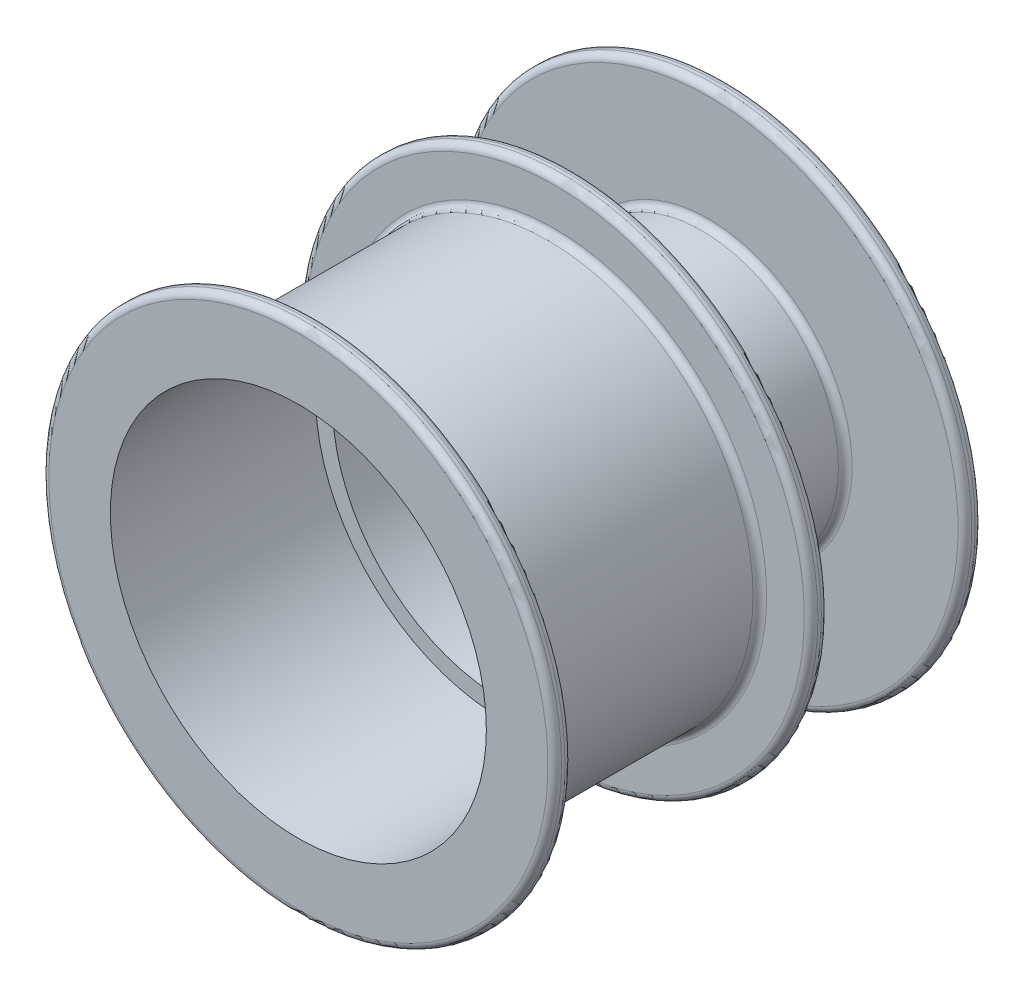
ISO-10303-21;
HEADER;
FILE_DESCRIPTION(('STEP AP214'),'2;1');
FILE_NAME('part.step','',(''),(''),'','','');
FILE_SCHEMA(('AUTOMOTIVE_DESIGN { 1 0 10303 214 1 1 1 1 }'));
ENDSEC;
DATA;
#1=APPLICATION_CONTEXT('core data for automotive mechanical design processes');
#2=APPLICATION_PROTOCOL_DEFINITION('international standard','automotive_design',2000,#1);
#3=PRODUCT_CONTEXT('',#1,'mechanical');
#4=PRODUCT('Part','Part','',(#3));
#5=PRODUCT_RELATED_PRODUCT_CATEGORY('part','',(#4));
#6=PRODUCT_DEFINITION_FORMATION('','',#4);
#7=PRODUCT_DEFINITION_CONTEXT('part definition',#1,'design');
#8=PRODUCT_DEFINITION('design','',#6,#7);
#9=PRODUCT_DEFINITION_SHAPE('','',#8);
#10=(LENGTH_UNIT() NAMED_UNIT(*) SI_UNIT(.MILLI.,.METRE.));
#11=(NAMED_UNIT(*) PLANE_ANGLE_UNIT() SI_UNIT($,.RADIAN.));
#12=(NAMED_UNIT(*) SI_UNIT($,.STERADIAN.) SOLID_ANGLE_UNIT());
#13=UNCERTAINTY_MEASURE_WITH_UNIT(LENGTH_MEASURE(1.E-05),#10,'distance_accuracy_value','');
#14=(GEOMETRIC_REPRESENTATION_CONTEXT(3) GLOBAL_UNCERTAINTY_ASSIGNED_CONTEXT((#13)) GLOBAL_UNIT_ASSIGNED_CONTEXT((#10,
#11,#12)) REPRESENTATION_CONTEXT('',''));
#15=CARTESIAN_POINT('',(0.,0.,0.));
#16=DIRECTION('',(0.,0.,1.));
#17=DIRECTION('',(1.,0.,0.));
#18=AXIS2_PLACEMENT_3D('',#15,#16,#17);
#19=CARTESIAN_POINT('',(0.,0.,1.95845258946348));
#20=DIRECTION('',(0.,0.,1.));
#21=DIRECTION('',(1.,0.,0.));
#22=AXIS2_PLACEMENT_3D('',#19,#20,#21);
#23=CYLINDRICAL_SURFACE('',#22,47.625);
#24=CARTESIAN_POINT('',(0.,0.,-1.905));
#25=DIRECTION('',(0.,0.,1.));
#26=DIRECTION('',(1.,0.,0.));
#27=AXIS2_PLACEMENT_3D('',#24,#25,#26);
#28=CIRCLE('',#27,47.625);
#29=CARTESIAN_POINT('',(47.625,0.,-1.905));
#30=VERTEX_POINT('',#29);
#31=EDGE_CURVE('E61',#30,#30,#28,.T.);
#32=ORIENTED_EDGE('',*,*,#31,.T.);
#33=EDGE_LOOP('',(#32));
#34=FACE_BOUND('',#33,.T.);
#35=CARTESIAN_POINT('',(0.,0.,-1.27));
#36=DIRECTION('',(0.,0.,-1.));
#37=DIRECTION('',(-1.,0.,0.));
#38=AXIS2_PLACEMENT_3D('',#35,#36,#37);
#39=CIRCLE('',#38,47.625);
#40=CARTESIAN_POINT('',(-47.625,0.,-1.27));
#41=VERTEX_POINT('',#40);
#42=EDGE_CURVE('E64',#41,#41,#39,.T.);
#43=ORIENTED_EDGE('',*,*,#42,.T.);
#44=EDGE_LOOP('',(#43));
#45=FACE_BOUND('',#44,.T.);
#46=ADVANCED_FACE('F24',(#34,#45),#23,.T.);
#47=CARTESIAN_POINT('',(0.,47.625,0.));
#48=DIRECTION('',(0.,0.,-1.));
#49=DIRECTION('',(-1.,0.,0.));
#50=AXIS2_PLACEMENT_3D('',#47,#48,#49);
#51=PLANE('',#50);
#52=CARTESIAN_POINT('',(0.,0.,0.));
#53=DIRECTION('',(0.,0.,-1.));
#54=DIRECTION('',(-1.,0.,0.));
#55=AXIS2_PLACEMENT_3D('',#52,#53,#54);
#56=CIRCLE('',#55,46.355);
#57=CARTESIAN_POINT('',(-46.355,0.,0.));
#58=VERTEX_POINT('',#57);
#59=EDGE_CURVE('E55',#58,#58,#56,.F.);
#60=ORIENTED_EDGE('',*,*,#59,.T.);
#61=EDGE_LOOP('',(#60));
#62=FACE_BOUND('',#61,.T.);
#63=CARTESIAN_POINT('',(0.,0.,0.));
#64=DIRECTION('',(0.,0.,1.));
#65=DIRECTION('',(1.,0.,0.));
#66=AXIS2_PLACEMENT_3D('',#63,#64,#65);
#67=CIRCLE('',#66,34.925);
#68=CARTESIAN_POINT('',(34.925,0.,0.));
#69=VERTEX_POINT('',#68);
#70=EDGE_CURVE('E91',#69,#69,#67,.T.);
#71=ORIENTED_EDGE('',*,*,#70,.F.);
#72=EDGE_LOOP('',(#71));
#73=FACE_BOUND('',#72,.T.);
#74=ADVANCED_FACE('F157',(#62,#73),#51,.F.);
#75=CARTESIAN_POINT('',(0.,0.,1.95845258946348));
#76=DIRECTION('',(0.,0.,1.));
#77=DIRECTION('',(1.,0.,0.));
#78=AXIS2_PLACEMENT_3D('',#75,#76,#77);
#79=CYLINDRICAL_SURFACE('',#78,34.925);
#80=CARTESIAN_POINT('',(0.,0.,-38.1));
#81=DIRECTION('',(0.,0.,1.));
#82=DIRECTION('',(1.,0.,0.));
#83=AXIS2_PLACEMENT_3D('',#80,#81,#82);
#84=CIRCLE('',#83,34.925);
#85=CARTESIAN_POINT('',(34.925,0.,-38.1));
#86=VERTEX_POINT('',#85);
#87=EDGE_CURVE('E94',#86,#86,#84,.T.);
#88=ORIENTED_EDGE('',*,*,#87,.F.);
#89=EDGE_LOOP('',(#88));
#90=FACE_BOUND('',#89,.T.);
#91=ORIENTED_EDGE('',*,*,#70,.T.);
#92=EDGE_LOOP('',(#91));
#93=FACE_BOUND('',#92,.T.);
#94=ADVANCED_FACE('F151',(#90,#93),#79,.F.);
#95=CARTESIAN_POINT('',(0.,34.925,-38.1));
#96=DIRECTION('',(0.,0.,-1.));
#97=DIRECTION('',(-1.,0.,0.));
#98=AXIS2_PLACEMENT_3D('',#95,#96,#97);
#99=PLANE('',#98);
#100=CARTESIAN_POINT('',(0.,0.,-38.1));
#101=DIRECTION('',(0.,0.,1.));
#102=DIRECTION('',(1.,0.,0.));
#103=AXIS2_PLACEMENT_3D('',#100,#101,#102);
#104=CIRCLE('',#103,31.75);
#105=CARTESIAN_POINT('',(31.75,0.,-38.1));
#106=VERTEX_POINT('',#105);
#107=EDGE_CURVE('E97',#106,#106,#104,.T.);
#108=ORIENTED_EDGE('',*,*,#107,.F.);
#109=EDGE_LOOP('',(#108));
#110=FACE_BOUND('',#109,.T.);
#111=ORIENTED_EDGE('',*,*,#87,.T.);
#112=EDGE_LOOP('',(#111));
#113=FACE_BOUND('',#112,.T.);
#114=ADVANCED_FACE('F145',(#110,#113),#99,.F.);
#115=CARTESIAN_POINT('',(0.,0.,1.95845258946348));
#116=DIRECTION('',(0.,0.,1.));
#117=DIRECTION('',(1.,0.,0.));
#118=AXIS2_PLACEMENT_3D('',#115,#116,#117);
#119=CYLINDRICAL_SURFACE('',#118,31.75);
#120=CARTESIAN_POINT('',(0.,0.,-47.625));
#121=DIRECTION('',(0.,0.,1.));
#122=DIRECTION('',(1.,0.,0.));
#123=AXIS2_PLACEMENT_3D('',#120,#121,#122);
#124=CIRCLE('',#123,31.75);
#125=CARTESIAN_POINT('',(31.75,0.,-47.625));
#126=VERTEX_POINT('',#125);
#127=EDGE_CURVE('E100',#126,#126,#124,.T.);
#128=ORIENTED_EDGE('',*,*,#127,.F.);
#129=EDGE_LOOP('',(#128));
#130=FACE_BOUND('',#129,.T.);
#131=ORIENTED_EDGE('',*,*,#107,.T.);
#132=EDGE_LOOP('',(#131));
#133=FACE_BOUND('',#132,.T.);
#134=ADVANCED_FACE('F139',(#130,#133),#119,.F.);
#135=CARTESIAN_POINT('',(0.,31.75,-47.625));
#136=DIRECTION('',(0.,0.,-1.));
#137=DIRECTION('',(-1.,0.,0.));
#138=AXIS2_PLACEMENT_3D('',#135,#136,#137);
#139=PLANE('',#138);
#140=CARTESIAN_POINT('',(0.,0.,-47.625));
#141=DIRECTION('',(0.,0.,1.));
#142=DIRECTION('',(1.,0.,0.));
#143=AXIS2_PLACEMENT_3D('',#140,#141,#142);
#144=CIRCLE('',#143,6.35);
#145=CARTESIAN_POINT('',(6.35,0.,-47.625));
#146=VERTEX_POINT('',#145);
#147=EDGE_CURVE('E103',#146,#146,#144,.T.);
#148=ORIENTED_EDGE('',*,*,#147,.F.);
#149=EDGE_LOOP('',(#148));
#150=FACE_BOUND('',#149,.T.);
#151=ORIENTED_EDGE('',*,*,#127,.T.);
#152=EDGE_LOOP('',(#151));
#153=FACE_BOUND('',#152,.T.);
#154=ADVANCED_FACE('F133',(#150,#153),#139,.F.);
#155=CARTESIAN_POINT('',(0.,0.,1.95845258946348));
#156=DIRECTION('',(0.,0.,1.));
#157=DIRECTION('',(1.,0.,0.));
#158=AXIS2_PLACEMENT_3D('',#155,#156,#157);
#159=CYLINDRICAL_SURFACE('',#158,6.35);
#160=CARTESIAN_POINT('',(0.,0.,-55.118));
#161=DIRECTION('',(0.,0.,1.));
#162=DIRECTION('',(1.,0.,0.));
#163=AXIS2_PLACEMENT_3D('',#160,#161,#162);
#164=CIRCLE('',#163,6.35);
#165=CARTESIAN_POINT('',(6.35,0.,-55.118));
#166=VERTEX_POINT('',#165);
#167=EDGE_CURVE('E106',#166,#166,#164,.T.);
#168=ORIENTED_EDGE('',*,*,#167,.F.);
#169=EDGE_LOOP('',(#168));
#170=FACE_BOUND('',#169,.T.);
#171=ORIENTED_EDGE('',*,*,#147,.T.);
#172=EDGE_LOOP('',(#171));
#173=FACE_BOUND('',#172,.T.);
#174=ADVANCED_FACE('F127',(#170,#173),#159,.F.);
#175=CARTESIAN_POINT('',(0.,6.35,-55.118));
#176=DIRECTION('',(0.,0.,1.));
#177=DIRECTION('',(1.,0.,0.));
#178=AXIS2_PLACEMENT_3D('',#175,#176,#177);
#179=PLANE('',#178);
#180=CARTESIAN_POINT('',(0.,0.,-55.118));
#181=DIRECTION('',(0.,0.,1.));
#182=DIRECTION('',(1.,0.,0.));
#183=AXIS2_PLACEMENT_3D('',#180,#181,#182);
#184=CIRCLE('',#183,22.225);
#185=CARTESIAN_POINT('',(22.225,0.,-55.118));
#186=VERTEX_POINT('',#185);
#187=EDGE_CURVE('E109',#186,#186,#184,.T.);
#188=ORIENTED_EDGE('',*,*,#187,.F.);
#189=EDGE_LOOP('',(#188));
#190=FACE_BOUND('',#189,.T.);
#191=ORIENTED_EDGE('',*,*,#167,.T.);
#192=EDGE_LOOP('',(#191));
#193=FACE_BOUND('',#192,.T.);
#194=ADVANCED_FACE('F121',(#190,#193),#179,.F.);
#195=CARTESIAN_POINT('',(0.,0.,1.95845258946348));
#196=DIRECTION('',(0.,0.,1.));
#197=DIRECTION('',(1.,0.,0.));
#198=AXIS2_PLACEMENT_3D('',#195,#196,#197);
#199=CYLINDRICAL_SURFACE('',#198,22.225);
#200=CARTESIAN_POINT('',(0.,0.,-79.375));
#201=DIRECTION('',(0.,0.,1.));
#202=DIRECTION('',(1.,0.,0.));
#203=AXIS2_PLACEMENT_3D('',#200,#201,#202);
#204=CIRCLE('',#203,22.225);
#205=CARTESIAN_POINT('',(22.225,0.,-79.375));
#206=VERTEX_POINT('',#205);
#207=EDGE_CURVE('E112',#206,#206,#204,.T.);
#208=ORIENTED_EDGE('',*,*,#207,.F.);
#209=EDGE_LOOP('',(#208));
#210=FACE_BOUND('',#209,.T.);
#211=ORIENTED_EDGE('',*,*,#187,.T.);
#212=EDGE_LOOP('',(#211));
#213=FACE_BOUND('',#212,.T.);
#214=ADVANCED_FACE('F118',(#210,#213),#199,.F.);
#215=CARTESIAN_POINT('',(0.,47.625,-79.375));
#216=DIRECTION('',(0.,0.,1.));
#217=DIRECTION('',(1.,0.,0.));
#218=AXIS2_PLACEMENT_3D('',#215,#216,#217);
#219=PLANE('',#218);
#220=CARTESIAN_POINT('',(0.,0.,-79.375));
#221=DIRECTION('',(0.,0.,1.));
#222=DIRECTION('',(1.,0.,0.));
#223=AXIS2_PLACEMENT_3D('',#220,#221,#222);
#224=CIRCLE('',#223,46.355);
#225=CARTESIAN_POINT('',(46.355,0.,-79.375));
#226=VERTEX_POINT('',#225);
#227=EDGE_CURVE('E82',#226,#226,#224,.F.);
#228=ORIENTED_EDGE('',*,*,#227,.T.);
#229=EDGE_LOOP('',(#228));
#230=FACE_BOUND('',#229,.T.);
#231=ORIENTED_EDGE('',*,*,#207,.T.);
#232=EDGE_LOOP('',(#231));
#233=FACE_BOUND('',#232,.T.);
#234=ADVANCED_FACE('F116',(#230,#233),#219,.F.);
#235=CARTESIAN_POINT('',(0.,0.,1.95845258946348));
#236=DIRECTION('',(0.,0.,1.));
#237=DIRECTION('',(1.,0.,0.));
#238=AXIS2_PLACEMENT_3D('',#235,#236,#237);
#239=CYLINDRICAL_SURFACE('',#238,47.625);
#240=CARTESIAN_POINT('',(0.,0.,-78.105));
#241=DIRECTION('',(0.,0.,1.));
#242=DIRECTION('',(1.,0.,0.));
#243=AXIS2_PLACEMENT_3D('',#240,#241,#242);
#244=CIRCLE('',#243,47.625);
#245=CARTESIAN_POINT('',(47.625,0.,-78.105));
#246=VERTEX_POINT('',#245);
#247=EDGE_CURVE('E85',#246,#246,#244,.T.);
#248=ORIENTED_EDGE('',*,*,#247,.T.);
#249=EDGE_LOOP('',(#248));
#250=FACE_BOUND('',#249,.T.);
#251=CARTESIAN_POINT('',(0.,0.,-77.47));
#252=DIRECTION('',(0.,0.,-1.));
#253=DIRECTION('',(-1.,0.,0.));
#254=AXIS2_PLACEMENT_3D('',#251,#252,#253);
#255=CIRCLE('',#254,47.625);
#256=CARTESIAN_POINT('',(-47.625,0.,-77.47));
#257=VERTEX_POINT('',#256);
#258=EDGE_CURVE('E88',#257,#257,#255,.T.);
#259=ORIENTED_EDGE('',*,*,#258,.T.);
#260=EDGE_LOOP('',(#259));
#261=FACE_BOUND('',#260,.T.);
#262=ADVANCED_FACE('F170',(#250,#261),#239,.T.);
#263=CARTESIAN_POINT('',(0.,25.4,-76.2));
#264=DIRECTION('',(0.,0.,-1.));
#265=DIRECTION('',(-1.,0.,0.));
#266=AXIS2_PLACEMENT_3D('',#263,#264,#265);
#267=PLANE('',#266);
#268=CARTESIAN_POINT('',(0.,0.,-76.2));
#269=DIRECTION('',(0.,0.,-1.));
#270=DIRECTION('',(-1.,0.,0.));
#271=AXIS2_PLACEMENT_3D('',#268,#269,#270);
#272=CIRCLE('',#271,26.67);
#273=CARTESIAN_POINT('',(-26.67,0.,-76.2));
#274=VERTEX_POINT('',#273);
#275=EDGE_CURVE('E46',#274,#274,#272,.T.);
#276=ORIENTED_EDGE('',*,*,#275,.T.);
#277=EDGE_LOOP('',(#276));
#278=FACE_BOUND('',#277,.T.);
#279=CARTESIAN_POINT('',(0.,0.,-76.2));
#280=DIRECTION('',(0.,0.,-1.));
#281=DIRECTION('',(-1.,0.,0.));
#282=AXIS2_PLACEMENT_3D('',#279,#280,#281);
#283=CIRCLE('',#282,46.355);
#284=CARTESIAN_POINT('',(-46.355,0.,-76.2));
#285=VERTEX_POINT('',#284);
#286=EDGE_CURVE('E79',#285,#285,#283,.F.);
#287=ORIENTED_EDGE('',*,*,#286,.T.);
#288=EDGE_LOOP('',(#287));
#289=FACE_BOUND('',#288,.T.);
#290=ADVANCED_FACE('F174',(#278,#289),#267,.F.);
#291=CARTESIAN_POINT('',(0.,0.,1.95845258946348));
#292=DIRECTION('',(0.,0.,1.));
#293=DIRECTION('',(1.,0.,0.));
#294=AXIS2_PLACEMENT_3D('',#291,#292,#293);
#295=CYLINDRICAL_SURFACE('',#294,25.4);
#296=CARTESIAN_POINT('',(0.,0.,-74.93));
#297=DIRECTION('',(0.,0.,-1.));
#298=DIRECTION('',(-1.,0.,0.));
#299=AXIS2_PLACEMENT_3D('',#296,#297,#298);
#300=CIRCLE('',#299,25.4);
#301=CARTESIAN_POINT('',(-25.4,0.,-74.93));
#302=VERTEX_POINT('',#301);
#303=EDGE_CURVE('E49',#302,#302,#300,.F.);
#304=ORIENTED_EDGE('',*,*,#303,.T.);
#305=EDGE_LOOP('',(#304));
#306=FACE_BOUND('',#305,.T.);
#307=CARTESIAN_POINT('',(0.,0.,-52.07));
#308=DIRECTION('',(0.,0.,1.));
#309=DIRECTION('',(1.,0.,0.));
#310=AXIS2_PLACEMENT_3D('',#307,#308,#309);
#311=CIRCLE('',#310,25.4);
#312=CARTESIAN_POINT('',(25.4,0.,-52.07));
#313=VERTEX_POINT('',#312);
#314=EDGE_CURVE('E52',#313,#313,#311,.F.);
#315=ORIENTED_EDGE('',*,*,#314,.T.);
#316=EDGE_LOOP('',(#315));
#317=FACE_BOUND('',#316,.T.);
#318=ADVANCED_FACE('F178',(#306,#317),#295,.T.);
#319=CARTESIAN_POINT('',(0.,47.625,-50.8));
#320=DIRECTION('',(0.,0.,1.));
#321=DIRECTION('',(1.,0.,0.));
#322=AXIS2_PLACEMENT_3D('',#319,#320,#321);
#323=PLANE('',#322);
#324=CARTESIAN_POINT('',(0.,0.,-50.8));
#325=DIRECTION('',(0.,0.,1.));
#326=DIRECTION('',(1.,0.,0.));
#327=AXIS2_PLACEMENT_3D('',#324,#325,#326);
#328=CIRCLE('',#327,26.67);
#329=CARTESIAN_POINT('',(26.67,0.,-50.8));
#330=VERTEX_POINT('',#329);
#331=EDGE_CURVE('E43',#330,#330,#328,.T.);
#332=ORIENTED_EDGE('',*,*,#331,.T.);
#333=EDGE_LOOP('',(#332));
#334=FACE_BOUND('',#333,.T.);
#335=CARTESIAN_POINT('',(0.,0.,-50.8));
#336=DIRECTION('',(0.,0.,1.));
#337=DIRECTION('',(1.,0.,0.));
#338=AXIS2_PLACEMENT_3D('',#335,#336,#337);
#339=CIRCLE('',#338,46.355);
#340=CARTESIAN_POINT('',(46.355,0.,-50.8));
#341=VERTEX_POINT('',#340);
#342=EDGE_CURVE('E70',#341,#341,#339,.F.);
#343=ORIENTED_EDGE('',*,*,#342,.T.);
#344=EDGE_LOOP('',(#343));
#345=FACE_BOUND('',#344,.T.);
#346=ADVANCED_FACE('F182',(#334,#345),#323,.F.);
#347=CARTESIAN_POINT('',(0.,0.,1.95845258946348));
#348=DIRECTION('',(0.,0.,1.));
#349=DIRECTION('',(1.,0.,0.));
#350=AXIS2_PLACEMENT_3D('',#347,#348,#349);
#351=CYLINDRICAL_SURFACE('',#350,47.625);
#352=CARTESIAN_POINT('',(0.,0.,-49.53));
#353=DIRECTION('',(0.,0.,1.));
#354=DIRECTION('',(1.,0.,0.));
#355=AXIS2_PLACEMENT_3D('',#352,#353,#354);
#356=CIRCLE('',#355,47.625);
#357=CARTESIAN_POINT('',(47.625,0.,-49.53));
#358=VERTEX_POINT('',#357);
#359=EDGE_CURVE('E73',#358,#358,#356,.T.);
#360=ORIENTED_EDGE('',*,*,#359,.T.);
#361=EDGE_LOOP('',(#360));
#362=FACE_BOUND('',#361,.T.);
#363=CARTESIAN_POINT('',(0.,0.,-48.895));
#364=DIRECTION('',(0.,0.,-1.));
#365=DIRECTION('',(-1.,0.,0.));
#366=AXIS2_PLACEMENT_3D('',#363,#364,#365);
#367=CIRCLE('',#366,47.625);
#368=CARTESIAN_POINT('',(-47.625,0.,-48.895));
#369=VERTEX_POINT('',#368);
#370=EDGE_CURVE('E76',#369,#369,#367,.T.);
#371=ORIENTED_EDGE('',*,*,#370,.T.);
#372=EDGE_LOOP('',(#371));
#373=FACE_BOUND('',#372,.T.);
#374=ADVANCED_FACE('F186',(#362,#373),#351,.T.);
#375=CARTESIAN_POINT('',(0.,38.1,-47.625));
#376=DIRECTION('',(0.,0.,-1.));
#377=DIRECTION('',(-1.,0.,0.));
#378=AXIS2_PLACEMENT_3D('',#375,#376,#377);
#379=PLANE('',#378);
#380=CARTESIAN_POINT('',(0.,0.,-47.625));
#381=DIRECTION('',(0.,0.,-1.));
#382=DIRECTION('',(-1.,0.,0.));
#383=AXIS2_PLACEMENT_3D('',#380,#381,#382);
#384=CIRCLE('',#383,39.37);
#385=CARTESIAN_POINT('',(-39.37,0.,-47.625));
#386=VERTEX_POINT('',#385);
#387=EDGE_CURVE('E30',#386,#386,#384,.T.);
#388=ORIENTED_EDGE('',*,*,#387,.T.);
#389=EDGE_LOOP('',(#388));
#390=FACE_BOUND('',#389,.T.);
#391=CARTESIAN_POINT('',(0.,0.,-47.625));
#392=DIRECTION('',(0.,0.,-1.));
#393=DIRECTION('',(-1.,0.,0.));
#394=AXIS2_PLACEMENT_3D('',#391,#392,#393);
#395=CIRCLE('',#394,46.355);
#396=CARTESIAN_POINT('',(-46.355,0.,-47.625));
#397=VERTEX_POINT('',#396);
#398=EDGE_CURVE('E67',#397,#397,#395,.F.);
#399=ORIENTED_EDGE('',*,*,#398,.T.);
#400=EDGE_LOOP('',(#399));
#401=FACE_BOUND('',#400,.T.);
#402=ADVANCED_FACE('F190',(#390,#401),#379,.F.);
#403=CARTESIAN_POINT('',(0.,0.,1.95845258946348));
#404=DIRECTION('',(0.,0.,1.));
#405=DIRECTION('',(1.,0.,0.));
#406=AXIS2_PLACEMENT_3D('',#403,#404,#405);
#407=CYLINDRICAL_SURFACE('',#406,38.1);
#408=CARTESIAN_POINT('',(0.,0.,-46.355));
#409=DIRECTION('',(0.,0.,-1.));
#410=DIRECTION('',(-1.,0.,0.));
#411=AXIS2_PLACEMENT_3D('',#408,#409,#410);
#412=CIRCLE('',#411,38.1);
#413=CARTESIAN_POINT('',(-38.1,0.,-46.355));
#414=VERTEX_POINT('',#413);
#415=EDGE_CURVE('E34',#414,#414,#412,.F.);
#416=ORIENTED_EDGE('',*,*,#415,.T.);
#417=EDGE_LOOP('',(#416));
#418=FACE_BOUND('',#417,.T.);
#419=CARTESIAN_POINT('',(0.,0.,-4.445));
#420=DIRECTION('',(0.,0.,1.));
#421=DIRECTION('',(1.,0.,0.));
#422=AXIS2_PLACEMENT_3D('',#419,#420,#421);
#423=CIRCLE('',#422,38.1);
#424=CARTESIAN_POINT('',(38.1,0.,-4.445));
#425=VERTEX_POINT('',#424);
#426=EDGE_CURVE('E38',#425,#425,#423,.F.);
#427=ORIENTED_EDGE('',*,*,#426,.T.);
#428=EDGE_LOOP('',(#427));
#429=FACE_BOUND('',#428,.T.);
#430=ADVANCED_FACE('F194',(#418,#429),#407,.T.);
#431=CARTESIAN_POINT('',(0.,47.625,-3.175));
#432=DIRECTION('',(0.,0.,1.));
#433=DIRECTION('',(1.,0.,0.));
#434=AXIS2_PLACEMENT_3D('',#431,#432,#433);
#435=PLANE('',#434);
#436=CARTESIAN_POINT('',(0.,0.,-3.175));
#437=DIRECTION('',(0.,0.,1.));
#438=DIRECTION('',(1.,0.,0.));
#439=AXIS2_PLACEMENT_3D('',#436,#437,#438);
#440=CIRCLE('',#439,39.37);
#441=CARTESIAN_POINT('',(39.37,0.,-3.175));
#442=VERTEX_POINT('',#441);
#443=EDGE_CURVE('E10',#442,#442,#440,.T.);
#444=ORIENTED_EDGE('',*,*,#443,.T.);
#445=EDGE_LOOP('',(#444));
#446=FACE_BOUND('',#445,.T.);
#447=CARTESIAN_POINT('',(0.,0.,-3.175));
#448=DIRECTION('',(0.,0.,1.));
#449=DIRECTION('',(1.,0.,0.));
#450=AXIS2_PLACEMENT_3D('',#447,#448,#449);
#451=CIRCLE('',#450,46.355);
#452=CARTESIAN_POINT('',(46.355,0.,-3.175));
#453=VERTEX_POINT('',#452);
#454=EDGE_CURVE('E58',#453,#453,#451,.F.);
#455=ORIENTED_EDGE('',*,*,#454,.T.);
#456=EDGE_LOOP('',(#455));
#457=FACE_BOUND('',#456,.T.);
#458=ADVANCED_FACE('F197',(#446,#457),#435,.F.);
#459=CARTESIAN_POINT('',(0.,0.,-78.105));
#460=DIRECTION('',(0.,0.,1.));
#461=DIRECTION('',(1.,0.,0.));
#462=AXIS2_PLACEMENT_3D('',#459,#460,#461);
#463=TOROIDAL_SURFACE('',#462,46.355,1.27);
#464=ORIENTED_EDGE('',*,*,#227,.F.);
#465=EDGE_LOOP('',(#464));
#466=FACE_BOUND('',#465,.T.);
#467=ORIENTED_EDGE('',*,*,#247,.F.);
#468=EDGE_LOOP('',(#467));
#469=FACE_BOUND('',#468,.T.);
#470=ADVANCED_FACE('F201',(#466,#469),#463,.T.);
#471=CARTESIAN_POINT('',(0.,0.,-77.47));
#472=DIRECTION('',(0.,0.,-1.));
#473=DIRECTION('',(-1.,0.,0.));
#474=AXIS2_PLACEMENT_3D('',#471,#472,#473);
#475=TOROIDAL_SURFACE('',#474,46.355,1.27);
#476=ORIENTED_EDGE('',*,*,#258,.F.);
#477=EDGE_LOOP('',(#476));
#478=FACE_BOUND('',#477,.T.);
#479=ORIENTED_EDGE('',*,*,#286,.F.);
#480=EDGE_LOOP('',(#479));
#481=FACE_BOUND('',#480,.T.);
#482=ADVANCED_FACE('F204',(#478,#481),#475,.T.);
#483=CARTESIAN_POINT('',(0.,0.,-49.53));
#484=DIRECTION('',(0.,0.,1.));
#485=DIRECTION('',(1.,0.,0.));
#486=AXIS2_PLACEMENT_3D('',#483,#484,#485);
#487=TOROIDAL_SURFACE('',#486,46.355,1.27);
#488=ORIENTED_EDGE('',*,*,#342,.F.);
#489=EDGE_LOOP('',(#488));
#490=FACE_BOUND('',#489,.T.);
#491=ORIENTED_EDGE('',*,*,#359,.F.);
#492=EDGE_LOOP('',(#491));
#493=FACE_BOUND('',#492,.T.);
#494=ADVANCED_FACE('F208',(#490,#493),#487,.T.);
#495=CARTESIAN_POINT('',(0.,0.,-48.895));
#496=DIRECTION('',(0.,0.,-1.));
#497=DIRECTION('',(-1.,0.,0.));
#498=AXIS2_PLACEMENT_3D('',#495,#496,#497);
#499=TOROIDAL_SURFACE('',#498,46.355,1.27);
#500=ORIENTED_EDGE('',*,*,#370,.F.);
#501=EDGE_LOOP('',(#500));
#502=FACE_BOUND('',#501,.T.);
#503=ORIENTED_EDGE('',*,*,#398,.F.);
#504=EDGE_LOOP('',(#503));
#505=FACE_BOUND('',#504,.T.);
#506=ADVANCED_FACE('F212',(#502,#505),#499,.T.);
#507=CARTESIAN_POINT('',(0.,0.,-1.905));
#508=DIRECTION('',(0.,0.,1.));
#509=DIRECTION('',(1.,0.,0.));
#510=AXIS2_PLACEMENT_3D('',#507,#508,#509);
#511=TOROIDAL_SURFACE('',#510,46.355,1.27);
#512=ORIENTED_EDGE('',*,*,#454,.F.);
#513=EDGE_LOOP('',(#512));
#514=FACE_BOUND('',#513,.T.);
#515=ORIENTED_EDGE('',*,*,#31,.F.);
#516=EDGE_LOOP('',(#515));
#517=FACE_BOUND('',#516,.T.);
#518=ADVANCED_FACE('F216',(#514,#517),#511,.T.);
#519=CARTESIAN_POINT('',(0.,0.,-1.27));
#520=DIRECTION('',(0.,0.,-1.));
#521=DIRECTION('',(-1.,0.,0.));
#522=AXIS2_PLACEMENT_3D('',#519,#520,#521);
#523=TOROIDAL_SURFACE('',#522,46.355,1.27);
#524=ORIENTED_EDGE('',*,*,#42,.F.);
#525=EDGE_LOOP('',(#524));
#526=FACE_BOUND('',#525,.T.);
#527=ORIENTED_EDGE('',*,*,#59,.F.);
#528=EDGE_LOOP('',(#527));
#529=FACE_BOUND('',#528,.T.);
#530=ADVANCED_FACE('F220',(#526,#529),#523,.T.);
#531=CARTESIAN_POINT('',(0.,0.,-74.93));
#532=DIRECTION('',(0.,0.,-1.));
#533=DIRECTION('',(-1.,0.,0.));
#534=AXIS2_PLACEMENT_3D('',#531,#532,#533);
#535=TOROIDAL_SURFACE('',#534,26.67,1.27);
#536=ORIENTED_EDGE('',*,*,#275,.F.);
#537=EDGE_LOOP('',(#536));
#538=FACE_BOUND('',#537,.T.);
#539=ORIENTED_EDGE('',*,*,#303,.F.);
#540=EDGE_LOOP('',(#539));
#541=FACE_BOUND('',#540,.T.);
#542=ADVANCED_FACE('F224',(#538,#541),#535,.F.);
#543=CARTESIAN_POINT('',(0.,0.,-52.07));
#544=DIRECTION('',(0.,0.,1.));
#545=DIRECTION('',(1.,0.,0.));
#546=AXIS2_PLACEMENT_3D('',#543,#544,#545);
#547=TOROIDAL_SURFACE('',#546,26.67,1.27);
#548=ORIENTED_EDGE('',*,*,#314,.F.);
#549=EDGE_LOOP('',(#548));
#550=FACE_BOUND('',#549,.T.);
#551=ORIENTED_EDGE('',*,*,#331,.F.);
#552=EDGE_LOOP('',(#551));
#553=FACE_BOUND('',#552,.T.);
#554=ADVANCED_FACE('F228',(#550,#553),#547,.F.);
#555=CARTESIAN_POINT('',(0.,0.,-46.355));
#556=DIRECTION('',(0.,0.,-1.));
#557=DIRECTION('',(-1.,0.,0.));
#558=AXIS2_PLACEMENT_3D('',#555,#556,#557);
#559=TOROIDAL_SURFACE('',#558,39.37,1.27);
#560=ORIENTED_EDGE('',*,*,#387,.F.);
#561=EDGE_LOOP('',(#560));
#562=FACE_BOUND('',#561,.T.);
#563=ORIENTED_EDGE('',*,*,#415,.F.);
#564=EDGE_LOOP('',(#563));
#565=FACE_BOUND('',#564,.T.);
#566=ADVANCED_FACE('F232',(#562,#565),#559,.F.);
#567=CARTESIAN_POINT('',(0.,0.,-4.445));
#568=DIRECTION('',(0.,0.,1.));
#569=DIRECTION('',(1.,0.,0.));
#570=AXIS2_PLACEMENT_3D('',#567,#568,#569);
#571=TOROIDAL_SURFACE('',#570,39.37,1.27);
#572=ORIENTED_EDGE('',*,*,#426,.F.);
#573=EDGE_LOOP('',(#572));
#574=FACE_BOUND('',#573,.T.);
#575=ORIENTED_EDGE('',*,*,#443,.F.);
#576=EDGE_LOOP('',(#575));
#577=FACE_BOUND('',#576,.T.);
#578=ADVANCED_FACE('F236',(#574,#577),#571,.F.);
#579=CLOSED_SHELL('',(#46,#74,#94,#114,#134,#154,#174,#194,#214,#234,#262,#290,#318,#346,#374,
#402,#430,#458,#470,#482,#494,#506,#518,#530,#542,#554,#566,#578));
#580=MANIFOLD_SOLID_BREP('B2',#579);
#581=ADVANCED_BREP_SHAPE_REPRESENTATION('',(#18,#580),#14);
#582=SHAPE_DEFINITION_REPRESENTATION(#9,#581);
ENDSEC;
END-ISO-10303-21;
